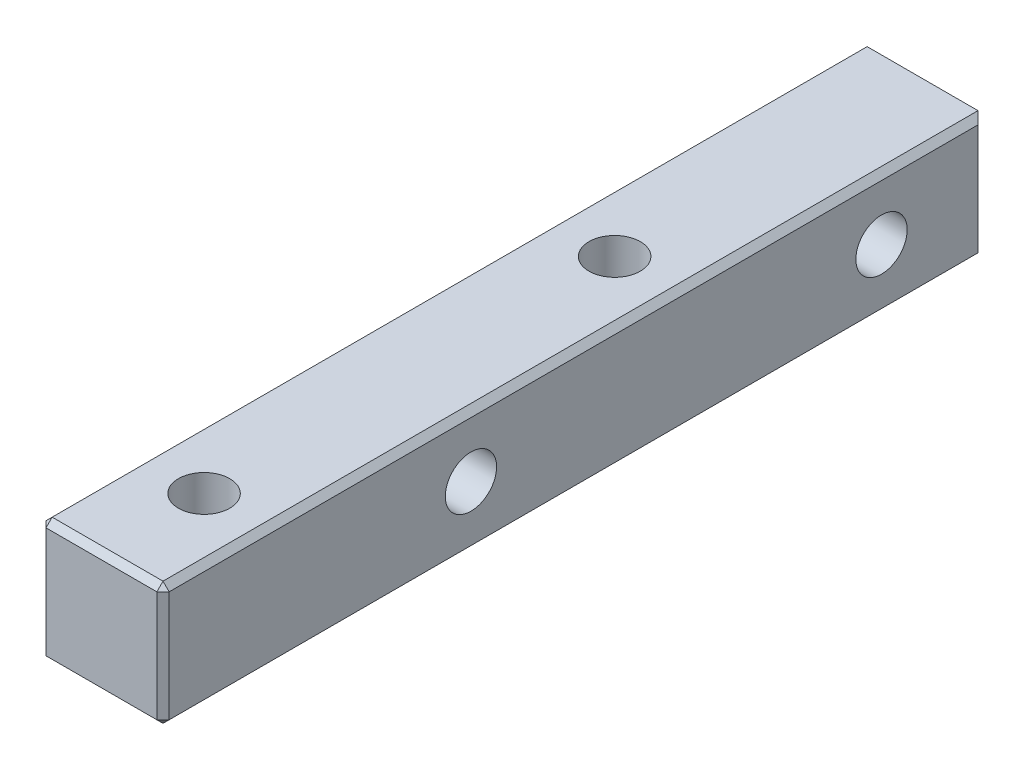
ISO-10303-21;
HEADER;
FILE_DESCRIPTION(('STEP AP214'),'2;1');
FILE_NAME('part.step','',(''),(''),'','','');
FILE_SCHEMA(('AUTOMOTIVE_DESIGN { 1 0 10303 214 1 1 1 1 }'));
ENDSEC;
DATA;
#1=APPLICATION_CONTEXT('core data for automotive mechanical design processes');
#2=APPLICATION_PROTOCOL_DEFINITION('international standard','automotive_design',2000,#1);
#3=PRODUCT_CONTEXT('',#1,'mechanical');
#4=PRODUCT('Part','Part','',(#3));
#5=PRODUCT_RELATED_PRODUCT_CATEGORY('part','',(#4));
#6=PRODUCT_DEFINITION_FORMATION('','',#4);
#7=PRODUCT_DEFINITION_CONTEXT('part definition',#1,'design');
#8=PRODUCT_DEFINITION('design','',#6,#7);
#9=PRODUCT_DEFINITION_SHAPE('','',#8);
#10=(LENGTH_UNIT() NAMED_UNIT(*) SI_UNIT(.MILLI.,.METRE.));
#11=(NAMED_UNIT(*) PLANE_ANGLE_UNIT() SI_UNIT($,.RADIAN.));
#12=(NAMED_UNIT(*) SI_UNIT($,.STERADIAN.) SOLID_ANGLE_UNIT());
#13=UNCERTAINTY_MEASURE_WITH_UNIT(LENGTH_MEASURE(1.E-05),#10,'distance_accuracy_value','');
#14=(GEOMETRIC_REPRESENTATION_CONTEXT(3) GLOBAL_UNCERTAINTY_ASSIGNED_CONTEXT((#13)) GLOBAL_UNIT_ASSIGNED_CONTEXT((#10,
#11,#12)) REPRESENTATION_CONTEXT('',''));
#15=CARTESIAN_POINT('',(0.,0.,0.));
#16=DIRECTION('',(0.,0.,1.));
#17=DIRECTION('',(1.,0.,0.));
#18=AXIS2_PLACEMENT_3D('',#15,#16,#17);
#19=CARTESIAN_POINT('',(-3.,3.,20.));
#20=DIRECTION('',(0.,-1.,0.));
#21=DIRECTION('',(1.,0.,0.));
#22=AXIS2_PLACEMENT_3D('',#19,#20,#21);
#23=PLANE('',#22);
#24=DIRECTION('',(1.,0.,0.));
#25=VECTOR('',#24,1.);
#26=CARTESIAN_POINT('',(-3.,3.,19.7));
#27=LINE('',#26,#25);
#28=CARTESIAN_POINT('',(-2.7,3.,19.7));
#29=VERTEX_POINT('',#28);
#30=CARTESIAN_POINT('',(2.7,3.,19.7));
#31=VERTEX_POINT('',#30);
#32=EDGE_CURVE('E57',#29,#31,#27,.T.);
#33=ORIENTED_EDGE('',*,*,#32,.T.);
#34=DIRECTION('',(0.,0.,-1.));
#35=VECTOR('',#34,1.);
#36=CARTESIAN_POINT('',(2.7,3.,20.));
#37=LINE('',#36,#35);
#38=CARTESIAN_POINT('',(2.7,3.,-20.));
#39=VERTEX_POINT('',#38);
#40=EDGE_CURVE('E11',#31,#39,#37,.T.);
#41=ORIENTED_EDGE('',*,*,#40,.T.);
#42=DIRECTION('',(-1.,0.,0.));
#43=VECTOR('',#42,1.);
#44=CARTESIAN_POINT('',(-3.,3.,-20.));
#45=LINE('',#44,#43);
#46=CARTESIAN_POINT('',(-2.7,3.,-20.));
#47=VERTEX_POINT('',#46);
#48=EDGE_CURVE('E163',#39,#47,#45,.T.);
#49=ORIENTED_EDGE('',*,*,#48,.T.);
#50=DIRECTION('',(0.,0.,1.));
#51=VECTOR('',#50,1.);
#52=CARTESIAN_POINT('',(-2.7,3.,20.));
#53=LINE('',#52,#51);
#54=EDGE_CURVE('E68',#47,#29,#53,.T.);
#55=ORIENTED_EDGE('',*,*,#54,.T.);
#56=EDGE_LOOP('',(#33,#41,#49,#55));
#57=FACE_BOUND('',#56,.T.);
#58=CARTESIAN_POINT('',(0.,3.,15.));
#59=DIRECTION('',(0.,1.,0.));
#60=DIRECTION('',(0.,0.,1.));
#61=AXIS2_PLACEMENT_3D('',#58,#59,#60);
#62=CIRCLE('',#61,1.24999999999999);
#63=CARTESIAN_POINT('',(0.,3.,16.25));
#64=VERTEX_POINT('',#63);
#65=EDGE_CURVE('E303',#64,#64,#62,.T.);
#66=ORIENTED_EDGE('',*,*,#65,.F.);
#67=EDGE_LOOP('',(#66));
#68=FACE_BOUND('',#67,.T.);
#69=CARTESIAN_POINT('',(0.,3.,-5.));
#70=DIRECTION('',(0.,1.,0.));
#71=DIRECTION('',(0.,0.,1.));
#72=AXIS2_PLACEMENT_3D('',#69,#70,#71);
#73=CIRCLE('',#72,1.24999999999999);
#74=CARTESIAN_POINT('',(0.,3.,-3.75000000000001));
#75=VERTEX_POINT('',#74);
#76=EDGE_CURVE('E291',#75,#75,#73,.T.);
#77=ORIENTED_EDGE('',*,*,#76,.F.);
#78=EDGE_LOOP('',(#77));
#79=FACE_BOUND('',#78,.T.);
#80=ADVANCED_FACE('F46',(#57,#68,#79),#23,.F.);
#81=CARTESIAN_POINT('',(3.,-3.,20.));
#82=DIRECTION('',(-1.,0.,0.));
#83=DIRECTION('',(0.,-1.,0.));
#84=AXIS2_PLACEMENT_3D('',#81,#82,#83);
#85=PLANE('',#84);
#86=DIRECTION('',(0.,0.,1.));
#87=VECTOR('',#86,1.);
#88=CARTESIAN_POINT('',(3.,2.7,20.));
#89=LINE('',#88,#87);
#90=CARTESIAN_POINT('',(3.,2.7,-19.7));
#91=VERTEX_POINT('',#90);
#92=CARTESIAN_POINT('',(3.,2.7,19.7));
#93=VERTEX_POINT('',#92);
#94=EDGE_CURVE('E203',#91,#93,#89,.T.);
#95=ORIENTED_EDGE('',*,*,#94,.T.);
#96=DIRECTION('',(0.,-1.,0.));
#97=VECTOR('',#96,1.);
#98=CARTESIAN_POINT('',(3.,-3.,19.7));
#99=LINE('',#98,#97);
#100=CARTESIAN_POINT('',(3.,-2.7,19.7));
#101=VERTEX_POINT('',#100);
#102=EDGE_CURVE('E212',#93,#101,#99,.T.);
#103=ORIENTED_EDGE('',*,*,#102,.T.);
#104=DIRECTION('',(0.,0.,-1.));
#105=VECTOR('',#104,1.);
#106=CARTESIAN_POINT('',(3.,-2.7,20.));
#107=LINE('',#106,#105);
#108=CARTESIAN_POINT('',(3.,-2.7,-19.7));
#109=VERTEX_POINT('',#108);
#110=EDGE_CURVE('E209',#101,#109,#107,.T.);
#111=ORIENTED_EDGE('',*,*,#110,.T.);
#112=DIRECTION('',(0.,1.,0.));
#113=VECTOR('',#112,1.);
#114=CARTESIAN_POINT('',(3.,3.,-19.7));
#115=LINE('',#114,#113);
#116=EDGE_CURVE('E206',#109,#91,#115,.T.);
#117=ORIENTED_EDGE('',*,*,#116,.T.);
#118=EDGE_LOOP('',(#95,#103,#111,#117));
#119=FACE_BOUND('',#118,.T.);
#120=CARTESIAN_POINT('',(3.,0.,-15.));
#121=DIRECTION('',(-1.,0.,0.));
#122=DIRECTION('',(0.,-1.,0.));
#123=AXIS2_PLACEMENT_3D('',#120,#121,#122);
#124=CIRCLE('',#123,1.24999999999999);
#125=CARTESIAN_POINT('',(3.,-1.24999999999999,-15.));
#126=VERTEX_POINT('',#125);
#127=EDGE_CURVE('E317',#126,#126,#124,.T.);
#128=ORIENTED_EDGE('',*,*,#127,.T.);
#129=EDGE_LOOP('',(#128));
#130=FACE_BOUND('',#129,.T.);
#131=CARTESIAN_POINT('',(3.,0.,5.));
#132=DIRECTION('',(-1.,0.,0.));
#133=DIRECTION('',(0.,-1.,0.));
#134=AXIS2_PLACEMENT_3D('',#131,#132,#133);
#135=CIRCLE('',#134,1.24999999999999);
#136=CARTESIAN_POINT('',(3.,-1.24999999999999,5.));
#137=VERTEX_POINT('',#136);
#138=EDGE_CURVE('E325',#137,#137,#135,.T.);
#139=ORIENTED_EDGE('',*,*,#138,.T.);
#140=EDGE_LOOP('',(#139));
#141=FACE_BOUND('',#140,.T.);
#142=ADVANCED_FACE('F380',(#119,#130,#141),#85,.F.);
#143=CARTESIAN_POINT('',(-3.,-3.,20.));
#144=DIRECTION('',(1.,0.,0.));
#145=DIRECTION('',(0.,0.,-1.));
#146=AXIS2_PLACEMENT_3D('',#143,#144,#145);
#147=PLANE('',#146);
#148=DIRECTION('',(0.,-1.,0.));
#149=VECTOR('',#148,1.);
#150=CARTESIAN_POINT('',(-3.,-3.,-19.7));
#151=LINE('',#150,#149);
#152=CARTESIAN_POINT('',(-3.,2.7,-19.7));
#153=VERTEX_POINT('',#152);
#154=CARTESIAN_POINT('',(-3.,-2.7,-19.7));
#155=VERTEX_POINT('',#154);
#156=EDGE_CURVE('E185',#153,#155,#151,.T.);
#157=ORIENTED_EDGE('',*,*,#156,.T.);
#158=DIRECTION('',(0.,0.,1.));
#159=VECTOR('',#158,1.);
#160=CARTESIAN_POINT('',(-3.,-2.7,20.));
#161=LINE('',#160,#159);
#162=CARTESIAN_POINT('',(-3.,-2.7,19.7));
#163=VERTEX_POINT('',#162);
#164=EDGE_CURVE('E137',#155,#163,#161,.T.);
#165=ORIENTED_EDGE('',*,*,#164,.T.);
#166=DIRECTION('',(0.,1.,0.));
#167=VECTOR('',#166,1.);
#168=CARTESIAN_POINT('',(-3.,-3.,19.7));
#169=LINE('',#168,#167);
#170=CARTESIAN_POINT('',(-3.,2.7,19.7));
#171=VERTEX_POINT('',#170);
#172=EDGE_CURVE('E182',#163,#171,#169,.T.);
#173=ORIENTED_EDGE('',*,*,#172,.T.);
#174=DIRECTION('',(0.,0.,-1.));
#175=VECTOR('',#174,1.);
#176=CARTESIAN_POINT('',(-3.,2.7,20.));
#177=LINE('',#176,#175);
#178=EDGE_CURVE('E175',#171,#153,#177,.T.);
#179=ORIENTED_EDGE('',*,*,#178,.T.);
#180=EDGE_LOOP('',(#157,#165,#173,#179));
#181=FACE_BOUND('',#180,.T.);
#182=CARTESIAN_POINT('',(-3.,0.,-15.));
#183=DIRECTION('',(-1.,0.,0.));
#184=DIRECTION('',(0.,0.,1.));
#185=AXIS2_PLACEMENT_3D('',#182,#183,#184);
#186=CIRCLE('',#185,1.24999999999999);
#187=CARTESIAN_POINT('',(-3.,0.,-13.75));
#188=VERTEX_POINT('',#187);
#189=EDGE_CURVE('E313',#188,#188,#186,.T.);
#190=ORIENTED_EDGE('',*,*,#189,.F.);
#191=EDGE_LOOP('',(#190));
#192=FACE_BOUND('',#191,.T.);
#193=CARTESIAN_POINT('',(-3.,0.,5.));
#194=DIRECTION('',(-1.,0.,0.));
#195=DIRECTION('',(0.,0.,1.));
#196=AXIS2_PLACEMENT_3D('',#193,#194,#195);
#197=CIRCLE('',#196,1.24999999999999);
#198=CARTESIAN_POINT('',(-3.,0.,6.24999999999999));
#199=VERTEX_POINT('',#198);
#200=EDGE_CURVE('E321',#199,#199,#197,.T.);
#201=ORIENTED_EDGE('',*,*,#200,.F.);
#202=EDGE_LOOP('',(#201));
#203=FACE_BOUND('',#202,.T.);
#204=ADVANCED_FACE('F343',(#181,#192,#203),#147,.F.);
#205=CARTESIAN_POINT('',(-3.,-3.,20.));
#206=DIRECTION('',(0.,1.,0.));
#207=DIRECTION('',(0.,0.,1.));
#208=AXIS2_PLACEMENT_3D('',#205,#206,#207);
#209=PLANE('',#208);
#210=DIRECTION('',(0.,0.,1.));
#211=VECTOR('',#210,1.);
#212=CARTESIAN_POINT('',(2.7,-3.,20.));
#213=LINE('',#212,#211);
#214=CARTESIAN_POINT('',(2.7,-3.,-19.7));
#215=VERTEX_POINT('',#214);
#216=CARTESIAN_POINT('',(2.7,-3.,19.7));
#217=VERTEX_POINT('',#216);
#218=EDGE_CURVE('E162',#215,#217,#213,.T.);
#219=ORIENTED_EDGE('',*,*,#218,.T.);
#220=DIRECTION('',(-1.,0.,0.));
#221=VECTOR('',#220,1.);
#222=CARTESIAN_POINT('',(-3.,-3.,19.7));
#223=LINE('',#222,#221);
#224=CARTESIAN_POINT('',(-2.7,-3.,19.7));
#225=VERTEX_POINT('',#224);
#226=EDGE_CURVE('E168',#217,#225,#223,.T.);
#227=ORIENTED_EDGE('',*,*,#226,.T.);
#228=DIRECTION('',(0.,0.,-1.));
#229=VECTOR('',#228,1.);
#230=CARTESIAN_POINT('',(-2.7,-3.,20.));
#231=LINE('',#230,#229);
#232=CARTESIAN_POINT('',(-2.7,-3.,-19.7));
#233=VERTEX_POINT('',#232);
#234=EDGE_CURVE('E135',#225,#233,#231,.T.);
#235=ORIENTED_EDGE('',*,*,#234,.T.);
#236=DIRECTION('',(1.,0.,0.));
#237=VECTOR('',#236,1.);
#238=CARTESIAN_POINT('',(3.,-3.,-19.7));
#239=LINE('',#238,#237);
#240=EDGE_CURVE('E155',#233,#215,#239,.T.);
#241=ORIENTED_EDGE('',*,*,#240,.T.);
#242=EDGE_LOOP('',(#219,#227,#235,#241));
#243=FACE_BOUND('',#242,.T.);
#244=CARTESIAN_POINT('',(0.,-3.,-5.));
#245=DIRECTION('',(0.,1.,0.));
#246=DIRECTION('',(0.,0.,1.));
#247=AXIS2_PLACEMENT_3D('',#244,#245,#246);
#248=CIRCLE('',#247,1.24999999999999);
#249=CARTESIAN_POINT('',(0.,-3.,-3.75000000000001));
#250=VERTEX_POINT('',#249);
#251=EDGE_CURVE('E297',#250,#250,#248,.T.);
#252=ORIENTED_EDGE('',*,*,#251,.T.);
#253=EDGE_LOOP('',(#252));
#254=FACE_BOUND('',#253,.T.);
#255=CARTESIAN_POINT('',(0.,-3.,15.));
#256=DIRECTION('',(0.,1.,0.));
#257=DIRECTION('',(0.,0.,1.));
#258=AXIS2_PLACEMENT_3D('',#255,#256,#257);
#259=CIRCLE('',#258,1.24999999999999);
#260=CARTESIAN_POINT('',(0.,-3.,16.25));
#261=VERTEX_POINT('',#260);
#262=EDGE_CURVE('E309',#261,#261,#259,.T.);
#263=ORIENTED_EDGE('',*,*,#262,.T.);
#264=EDGE_LOOP('',(#263));
#265=FACE_BOUND('',#264,.T.);
#266=ADVANCED_FACE('F165',(#243,#254,#265),#209,.F.);
#267=CARTESIAN_POINT('',(0.,0.,20.));
#268=DIRECTION('',(0.,0.,-1.));
#269=DIRECTION('',(-1.,0.,0.));
#270=AXIS2_PLACEMENT_3D('',#267,#268,#269);
#271=PLANE('',#270);
#272=DIRECTION('',(1.,0.,0.));
#273=VECTOR('',#272,1.);
#274=CARTESIAN_POINT('',(0.,-2.7,20.));
#275=LINE('',#274,#273);
#276=CARTESIAN_POINT('',(-2.7,-2.7,20.));
#277=VERTEX_POINT('',#276);
#278=CARTESIAN_POINT('',(2.7,-2.7,20.));
#279=VERTEX_POINT('',#278);
#280=EDGE_CURVE('E196',#277,#279,#275,.T.);
#281=ORIENTED_EDGE('',*,*,#280,.T.);
#282=DIRECTION('',(0.,1.,0.));
#283=VECTOR('',#282,1.);
#284=CARTESIAN_POINT('',(2.7,0.,20.));
#285=LINE('',#284,#283);
#286=CARTESIAN_POINT('',(2.7,2.7,20.));
#287=VERTEX_POINT('',#286);
#288=EDGE_CURVE('E199',#279,#287,#285,.T.);
#289=ORIENTED_EDGE('',*,*,#288,.T.);
#290=DIRECTION('',(-1.,0.,0.));
#291=VECTOR('',#290,1.);
#292=CARTESIAN_POINT('',(0.,2.7,20.));
#293=LINE('',#292,#291);
#294=CARTESIAN_POINT('',(-2.7,2.7,20.));
#295=VERTEX_POINT('',#294);
#296=EDGE_CURVE('E193',#287,#295,#293,.T.);
#297=ORIENTED_EDGE('',*,*,#296,.T.);
#298=DIRECTION('',(0.,-1.,0.));
#299=VECTOR('',#298,1.);
#300=CARTESIAN_POINT('',(-2.7,0.,20.));
#301=LINE('',#300,#299);
#302=EDGE_CURVE('E190',#295,#277,#301,.T.);
#303=ORIENTED_EDGE('',*,*,#302,.T.);
#304=EDGE_LOOP('',(#281,#289,#297,#303));
#305=FACE_BOUND('',#304,.T.);
#306=ADVANCED_FACE('F362',(#305),#271,.F.);
#307=CARTESIAN_POINT('',(0.,0.,-20.));
#308=DIRECTION('',(0.,0.,-1.));
#309=DIRECTION('',(-1.,0.,0.));
#310=AXIS2_PLACEMENT_3D('',#307,#308,#309);
#311=PLANE('',#310);
#312=DIRECTION('',(-1.,0.,0.));
#313=VECTOR('',#312,1.);
#314=CARTESIAN_POINT('',(-3.,-2.7,-20.));
#315=LINE('',#314,#313);
#316=CARTESIAN_POINT('',(2.7,-2.7,-20.));
#317=VERTEX_POINT('',#316);
#318=CARTESIAN_POINT('',(-2.7,-2.7,-20.));
#319=VERTEX_POINT('',#318);
#320=EDGE_CURVE('E219',#317,#319,#315,.T.);
#321=ORIENTED_EDGE('',*,*,#320,.T.);
#322=DIRECTION('',(0.,1.,0.));
#323=VECTOR('',#322,1.);
#324=CARTESIAN_POINT('',(-2.7,3.,-20.));
#325=LINE('',#324,#323);
#326=EDGE_CURVE('E223',#319,#47,#325,.T.);
#327=ORIENTED_EDGE('',*,*,#326,.T.);
#328=ORIENTED_EDGE('',*,*,#48,.F.);
#329=DIRECTION('',(0.,-1.,0.));
#330=VECTOR('',#329,1.);
#331=CARTESIAN_POINT('',(2.7,-3.,-20.));
#332=LINE('',#331,#330);
#333=EDGE_CURVE('E216',#39,#317,#332,.T.);
#334=ORIENTED_EDGE('',*,*,#333,.T.);
#335=EDGE_LOOP('',(#321,#327,#328,#334));
#336=FACE_BOUND('',#335,.T.);
#337=ADVANCED_FACE('F482',(#336),#311,.T.);
#338=CARTESIAN_POINT('',(-3.,0.,5.));
#339=DIRECTION('',(-1.,0.,0.));
#340=DIRECTION('',(0.,0.,1.));
#341=AXIS2_PLACEMENT_3D('',#338,#339,#340);
#342=CYLINDRICAL_SURFACE('',#341,1.24999999999999);
#343=ORIENTED_EDGE('',*,*,#138,.F.);
#344=EDGE_LOOP('',(#343));
#345=FACE_BOUND('',#344,.T.);
#346=ORIENTED_EDGE('',*,*,#200,.T.);
#347=EDGE_LOOP('',(#346));
#348=FACE_BOUND('',#347,.T.);
#349=ADVANCED_FACE('F478',(#345,#348),#342,.F.);
#350=CARTESIAN_POINT('',(-3.,0.,-15.));
#351=DIRECTION('',(-1.,0.,0.));
#352=DIRECTION('',(0.,0.,1.));
#353=AXIS2_PLACEMENT_3D('',#350,#351,#352);
#354=CYLINDRICAL_SURFACE('',#353,1.24999999999999);
#355=ORIENTED_EDGE('',*,*,#127,.F.);
#356=EDGE_LOOP('',(#355));
#357=FACE_BOUND('',#356,.T.);
#358=ORIENTED_EDGE('',*,*,#189,.T.);
#359=EDGE_LOOP('',(#358));
#360=FACE_BOUND('',#359,.T.);
#361=ADVANCED_FACE('F471',(#357,#360),#354,.F.);
#362=CARTESIAN_POINT('',(0.,3.,15.));
#363=DIRECTION('',(0.,1.,0.));
#364=DIRECTION('',(0.,0.,1.));
#365=AXIS2_PLACEMENT_3D('',#362,#363,#364);
#366=CYLINDRICAL_SURFACE('',#365,1.24999999999999);
#367=ORIENTED_EDGE('',*,*,#262,.F.);
#368=EDGE_LOOP('',(#367));
#369=FACE_BOUND('',#368,.T.);
#370=ORIENTED_EDGE('',*,*,#65,.T.);
#371=EDGE_LOOP('',(#370));
#372=FACE_BOUND('',#371,.T.);
#373=ADVANCED_FACE('F465',(#369,#372),#366,.F.);
#374=CARTESIAN_POINT('',(0.,3.,-5.));
#375=DIRECTION('',(0.,1.,0.));
#376=DIRECTION('',(0.,0.,1.));
#377=AXIS2_PLACEMENT_3D('',#374,#375,#376);
#378=CYLINDRICAL_SURFACE('',#377,1.24999999999999);
#379=ORIENTED_EDGE('',*,*,#251,.F.);
#380=EDGE_LOOP('',(#379));
#381=FACE_BOUND('',#380,.T.);
#382=ORIENTED_EDGE('',*,*,#76,.T.);
#383=EDGE_LOOP('',(#382));
#384=FACE_BOUND('',#383,.T.);
#385=ADVANCED_FACE('F461',(#381,#384),#378,.F.);
#386=CARTESIAN_POINT('',(2.7,2.7,20.));
#387=DIRECTION('',(0.577350269189626,0.577350269189626,0.577350269189626));
#388=DIRECTION('',(0.707106781186547,0.,-0.707106781186547));
#389=AXIS2_PLACEMENT_3D('',#386,#387,#388);
#390=PLANE('',#389);
#391=DIRECTION('',(-0.707106781186547,0.,0.707106781186547));
#392=VECTOR('',#391,1.);
#393=CARTESIAN_POINT('',(2.7,2.7,20.));
#394=LINE('',#393,#392);
#395=EDGE_CURVE('E282',#93,#287,#394,.T.);
#396=ORIENTED_EDGE('',*,*,#395,.F.);
#397=DIRECTION('',(0.707106781186547,-0.707106781186547,0.));
#398=VECTOR('',#397,1.);
#399=CARTESIAN_POINT('',(2.85,2.85,19.7));
#400=LINE('',#399,#398);
#401=EDGE_CURVE('E51',#31,#93,#400,.T.);
#402=ORIENTED_EDGE('',*,*,#401,.F.);
#403=DIRECTION('',(0.,0.707106781186547,-0.707106781186547));
#404=VECTOR('',#403,1.);
#405=CARTESIAN_POINT('',(2.7,2.7,20.));
#406=LINE('',#405,#404);
#407=EDGE_CURVE('E285',#287,#31,#406,.T.);
#408=ORIENTED_EDGE('',*,*,#407,.F.);
#409=EDGE_LOOP('',(#396,#402,#408));
#410=FACE_BOUND('',#409,.T.);
#411=ADVANCED_FACE('F49',(#410),#390,.T.);
#412=CARTESIAN_POINT('',(2.7,3.,20.));
#413=DIRECTION('',(-0.707106781186547,-0.707106781186547,0.));
#414=DIRECTION('',(0.,0.,-1.));
#415=AXIS2_PLACEMENT_3D('',#412,#413,#414);
#416=PLANE('',#415);
#417=ORIENTED_EDGE('',*,*,#401,.T.);
#418=ORIENTED_EDGE('',*,*,#94,.F.);
#419=DIRECTION('',(0.577350269189624,-0.577350269189624,0.57735026918963));
#420=VECTOR('',#419,1.);
#421=CARTESIAN_POINT('',(16.0333333333334,-10.3333333333334,-6.66666666666647));
#422=LINE('',#421,#420);
#423=EDGE_CURVE('E278',#39,#91,#422,.T.);
#424=ORIENTED_EDGE('',*,*,#423,.F.);
#425=ORIENTED_EDGE('',*,*,#40,.F.);
#426=EDGE_LOOP('',(#417,#418,#424,#425));
#427=FACE_BOUND('',#426,.T.);
#428=ADVANCED_FACE('F453',(#427),#416,.F.);
#429=CARTESIAN_POINT('',(0.,2.7,20.));
#430=DIRECTION('',(0.,-0.707106781186547,-0.707106781186547));
#431=DIRECTION('',(-1.,0.,0.));
#432=AXIS2_PLACEMENT_3D('',#429,#430,#431);
#433=PLANE('',#432);
#434=ORIENTED_EDGE('',*,*,#407,.T.);
#435=ORIENTED_EDGE('',*,*,#32,.F.);
#436=DIRECTION('',(0.,-0.707106781186548,0.707106781186548));
#437=VECTOR('',#436,1.);
#438=CARTESIAN_POINT('',(-2.7,2.7,20.));
#439=LINE('',#438,#437);
#440=EDGE_CURVE('E274',#295,#29,#439,.F.);
#441=ORIENTED_EDGE('',*,*,#440,.F.);
#442=ORIENTED_EDGE('',*,*,#296,.F.);
#443=EDGE_LOOP('',(#434,#435,#441,#442));
#444=FACE_BOUND('',#443,.T.);
#445=ADVANCED_FACE('F354',(#444),#433,.F.);
#446=CARTESIAN_POINT('',(2.7,0.,20.));
#447=DIRECTION('',(-0.707106781186547,0.,-0.707106781186547));
#448=DIRECTION('',(0.,1.,0.));
#449=AXIS2_PLACEMENT_3D('',#446,#447,#448);
#450=PLANE('',#449);
#451=ORIENTED_EDGE('',*,*,#395,.T.);
#452=ORIENTED_EDGE('',*,*,#288,.F.);
#453=DIRECTION('',(0.707106781186548,0.,-0.707106781186548));
#454=VECTOR('',#453,1.);
#455=CARTESIAN_POINT('',(3.,-2.7,19.7));
#456=LINE('',#455,#454);
#457=EDGE_CURVE('E270',#101,#279,#456,.F.);
#458=ORIENTED_EDGE('',*,*,#457,.F.);
#459=ORIENTED_EDGE('',*,*,#102,.F.);
#460=EDGE_LOOP('',(#451,#452,#458,#459));
#461=FACE_BOUND('',#460,.T.);
#462=ADVANCED_FACE('F360',(#461),#450,.F.);
#463=CARTESIAN_POINT('',(3.,-2.7,20.));
#464=DIRECTION('',(-0.707106781186547,0.707106781186547,0.));
#465=DIRECTION('',(0.,0.,-1.));
#466=AXIS2_PLACEMENT_3D('',#463,#464,#465);
#467=PLANE('',#466);
#468=DIRECTION('',(0.707106781186548,0.707106781186548,0.));
#469=VECTOR('',#468,1.);
#470=CARTESIAN_POINT('',(3.,-2.7,-19.7));
#471=LINE('',#470,#469);
#472=EDGE_CURVE('E263',#109,#215,#471,.F.);
#473=ORIENTED_EDGE('',*,*,#472,.F.);
#474=ORIENTED_EDGE('',*,*,#110,.F.);
#475=DIRECTION('',(-0.707106781186547,-0.707106781186547,0.));
#476=VECTOR('',#475,1.);
#477=CARTESIAN_POINT('',(3.,-2.7,19.7));
#478=LINE('',#477,#476);
#479=EDGE_CURVE('E267',#217,#101,#478,.F.);
#480=ORIENTED_EDGE('',*,*,#479,.F.);
#481=ORIENTED_EDGE('',*,*,#218,.F.);
#482=EDGE_LOOP('',(#473,#474,#480,#481));
#483=FACE_BOUND('',#482,.T.);
#484=ADVANCED_FACE('F442',(#483),#467,.F.);
#485=CARTESIAN_POINT('',(3.,-3.,-19.7));
#486=DIRECTION('',(0.707106781186552,0.,-0.707106781186543));
#487=DIRECTION('',(0.,-1.,0.));
#488=AXIS2_PLACEMENT_3D('',#485,#486,#487);
#489=PLANE('',#488);
#490=ORIENTED_EDGE('',*,*,#423,.T.);
#491=ORIENTED_EDGE('',*,*,#116,.F.);
#492=DIRECTION('',(0.707106781186543,0.,0.707106781186552));
#493=VECTOR('',#492,1.);
#494=CARTESIAN_POINT('',(3.,-2.7,-19.7));
#495=LINE('',#494,#493);
#496=EDGE_CURVE('E259',#317,#109,#495,.T.);
#497=ORIENTED_EDGE('',*,*,#496,.F.);
#498=ORIENTED_EDGE('',*,*,#333,.F.);
#499=EDGE_LOOP('',(#490,#491,#497,#498));
#500=FACE_BOUND('',#499,.T.);
#501=ADVANCED_FACE('F437',(#500),#489,.T.);
#502=CARTESIAN_POINT('',(-2.7,2.7,20.));
#503=DIRECTION('',(-0.577350269189626,0.577350269189626,0.577350269189626));
#504=DIRECTION('',(0.707106781186547,0.,0.707106781186547));
#505=AXIS2_PLACEMENT_3D('',#502,#503,#504);
#506=PLANE('',#505);
#507=DIRECTION('',(-0.707106781186547,0.,-0.707106781186547));
#508=VECTOR('',#507,1.);
#509=CARTESIAN_POINT('',(-2.7,2.7,20.));
#510=LINE('',#509,#508);
#511=EDGE_CURVE('E251',#295,#171,#510,.T.);
#512=ORIENTED_EDGE('',*,*,#511,.F.);
#513=ORIENTED_EDGE('',*,*,#440,.T.);
#514=DIRECTION('',(0.707106781186547,0.707106781186547,0.));
#515=VECTOR('',#514,1.);
#516=CARTESIAN_POINT('',(-2.85,2.85,19.7));
#517=LINE('',#516,#515);
#518=EDGE_CURVE('E255',#171,#29,#517,.T.);
#519=ORIENTED_EDGE('',*,*,#518,.F.);
#520=EDGE_LOOP('',(#512,#513,#519));
#521=FACE_BOUND('',#520,.T.);
#522=ADVANCED_FACE('F352',(#521),#506,.T.);
#523=CARTESIAN_POINT('',(3.,-2.7,19.7));
#524=DIRECTION('',(0.577350269189626,-0.577350269189626,0.577350269189626));
#525=DIRECTION('',(0.707106781186547,0.,-0.707106781186547));
#526=AXIS2_PLACEMENT_3D('',#523,#524,#525);
#527=PLANE('',#526);
#528=ORIENTED_EDGE('',*,*,#479,.T.);
#529=ORIENTED_EDGE('',*,*,#457,.T.);
#530=DIRECTION('',(0.,0.707106781186547,0.707106781186547));
#531=VECTOR('',#530,1.);
#532=CARTESIAN_POINT('',(2.7,-2.85,19.85));
#533=LINE('',#532,#531);
#534=EDGE_CURVE('E247',#217,#279,#533,.T.);
#535=ORIENTED_EDGE('',*,*,#534,.F.);
#536=EDGE_LOOP('',(#528,#529,#535));
#537=FACE_BOUND('',#536,.T.);
#538=ADVANCED_FACE('F428',(#537),#527,.T.);
#539=CARTESIAN_POINT('',(3.,-2.7,-19.7));
#540=DIRECTION('',(0.577350269189628,-0.577350269189628,-0.577350269189621));
#541=DIRECTION('',(0.707106781186547,0.707106781186547,0.));
#542=AXIS2_PLACEMENT_3D('',#539,#540,#541);
#543=PLANE('',#542);
#544=ORIENTED_EDGE('',*,*,#496,.T.);
#545=ORIENTED_EDGE('',*,*,#472,.T.);
#546=DIRECTION('',(0.,0.707106781186543,-0.707106781186552));
#547=VECTOR('',#546,1.);
#548=CARTESIAN_POINT('',(2.7,-2.85,-19.85));
#549=LINE('',#548,#547);
#550=EDGE_CURVE('E158',#317,#215,#549,.F.);
#551=ORIENTED_EDGE('',*,*,#550,.F.);
#552=EDGE_LOOP('',(#544,#545,#551));
#553=FACE_BOUND('',#552,.T.);
#554=ADVANCED_FACE('F423',(#553),#543,.T.);
#555=CARTESIAN_POINT('',(-3.,2.7,20.));
#556=DIRECTION('',(0.707106781186547,-0.707106781186547,0.));
#557=DIRECTION('',(0.,0.,-1.));
#558=AXIS2_PLACEMENT_3D('',#555,#556,#557);
#559=PLANE('',#558);
#560=ORIENTED_EDGE('',*,*,#518,.T.);
#561=ORIENTED_EDGE('',*,*,#54,.F.);
#562=DIRECTION('',(0.577350269189624,0.577350269189624,-0.57735026918963));
#563=VECTOR('',#562,1.);
#564=CARTESIAN_POINT('',(-16.2333333333334,-10.5333333333334,-6.46666666666646));
#565=LINE('',#564,#563);
#566=EDGE_CURVE('E241',#153,#47,#565,.T.);
#567=ORIENTED_EDGE('',*,*,#566,.F.);
#568=ORIENTED_EDGE('',*,*,#178,.F.);
#569=EDGE_LOOP('',(#560,#561,#567,#568));
#570=FACE_BOUND('',#569,.T.);
#571=ADVANCED_FACE('F336',(#570),#559,.F.);
#572=CARTESIAN_POINT('',(-2.7,0.,20.));
#573=DIRECTION('',(0.707106781186547,0.,-0.707106781186547));
#574=DIRECTION('',(0.,-1.,0.));
#575=AXIS2_PLACEMENT_3D('',#572,#573,#574);
#576=PLANE('',#575);
#577=ORIENTED_EDGE('',*,*,#511,.T.);
#578=ORIENTED_EDGE('',*,*,#172,.F.);
#579=DIRECTION('',(0.707106781186547,0.,0.707106781186547));
#580=VECTOR('',#579,1.);
#581=CARTESIAN_POINT('',(-3.,-2.7,19.7));
#582=LINE('',#581,#580);
#583=EDGE_CURVE('E237',#277,#163,#582,.F.);
#584=ORIENTED_EDGE('',*,*,#583,.F.);
#585=ORIENTED_EDGE('',*,*,#302,.F.);
#586=EDGE_LOOP('',(#577,#578,#584,#585));
#587=FACE_BOUND('',#586,.T.);
#588=ADVANCED_FACE('F350',(#587),#576,.F.);
#589=CARTESIAN_POINT('',(0.,-2.7,20.));
#590=DIRECTION('',(0.,0.707106781186547,-0.707106781186547));
#591=DIRECTION('',(1.,0.,0.));
#592=AXIS2_PLACEMENT_3D('',#589,#590,#591);
#593=PLANE('',#592);
#594=ORIENTED_EDGE('',*,*,#534,.T.);
#595=ORIENTED_EDGE('',*,*,#280,.F.);
#596=DIRECTION('',(0.,-0.707106781186547,-0.707106781186547));
#597=VECTOR('',#596,1.);
#598=CARTESIAN_POINT('',(-2.7,-2.85,19.85));
#599=LINE('',#598,#597);
#600=EDGE_CURVE('E152',#225,#277,#599,.F.);
#601=ORIENTED_EDGE('',*,*,#600,.F.);
#602=ORIENTED_EDGE('',*,*,#226,.F.);
#603=EDGE_LOOP('',(#594,#595,#601,#602));
#604=FACE_BOUND('',#603,.T.);
#605=ADVANCED_FACE('F365',(#604),#593,.F.);
#606=CARTESIAN_POINT('',(-3.,-3.,-19.7));
#607=DIRECTION('',(0.,-0.707106781186552,-0.707106781186543));
#608=DIRECTION('',(-1.,0.,0.));
#609=AXIS2_PLACEMENT_3D('',#606,#607,#608);
#610=PLANE('',#609);
#611=ORIENTED_EDGE('',*,*,#550,.T.);
#612=ORIENTED_EDGE('',*,*,#240,.F.);
#613=DIRECTION('',(0.,-0.707106781186543,0.707106781186552));
#614=VECTOR('',#613,1.);
#615=CARTESIAN_POINT('',(-2.7,-3.,-19.7));
#616=LINE('',#615,#614);
#617=EDGE_CURVE('E143',#319,#233,#616,.T.);
#618=ORIENTED_EDGE('',*,*,#617,.F.);
#619=ORIENTED_EDGE('',*,*,#320,.F.);
#620=EDGE_LOOP('',(#611,#612,#618,#619));
#621=FACE_BOUND('',#620,.T.);
#622=ADVANCED_FACE('F156',(#621),#610,.T.);
#623=CARTESIAN_POINT('',(-3.,-3.,-19.7));
#624=DIRECTION('',(-0.707106781186552,0.,-0.707106781186543));
#625=DIRECTION('',(0.,1.,0.));
#626=AXIS2_PLACEMENT_3D('',#623,#624,#625);
#627=PLANE('',#626);
#628=ORIENTED_EDGE('',*,*,#566,.T.);
#629=ORIENTED_EDGE('',*,*,#326,.F.);
#630=DIRECTION('',(0.707106781186543,0.,-0.707106781186552));
#631=VECTOR('',#630,1.);
#632=CARTESIAN_POINT('',(-2.85,-2.7,-19.85));
#633=LINE('',#632,#631);
#634=EDGE_CURVE('E147',#155,#319,#633,.T.);
#635=ORIENTED_EDGE('',*,*,#634,.F.);
#636=ORIENTED_EDGE('',*,*,#156,.F.);
#637=EDGE_LOOP('',(#628,#629,#635,#636));
#638=FACE_BOUND('',#637,.T.);
#639=ADVANCED_FACE('F341',(#638),#627,.T.);
#640=CARTESIAN_POINT('',(-3.,-2.7,19.7));
#641=DIRECTION('',(-0.577350269189626,-0.577350269189626,0.577350269189626));
#642=DIRECTION('',(0.707106781186547,0.,0.707106781186547));
#643=AXIS2_PLACEMENT_3D('',#640,#641,#642);
#644=PLANE('',#643);
#645=ORIENTED_EDGE('',*,*,#600,.T.);
#646=ORIENTED_EDGE('',*,*,#583,.T.);
#647=DIRECTION('',(-0.707106781186547,0.707106781186547,0.));
#648=VECTOR('',#647,1.);
#649=CARTESIAN_POINT('',(-3.,-2.7,19.7));
#650=LINE('',#649,#648);
#651=EDGE_CURVE('E140',#225,#163,#650,.T.);
#652=ORIENTED_EDGE('',*,*,#651,.F.);
#653=EDGE_LOOP('',(#645,#646,#652));
#654=FACE_BOUND('',#653,.T.);
#655=ADVANCED_FACE('F369',(#654),#644,.T.);
#656=CARTESIAN_POINT('',(-2.7,-3.,-19.7));
#657=DIRECTION('',(-0.577350269189628,-0.577350269189628,-0.577350269189621));
#658=DIRECTION('',(0.707106781186547,-0.707106781186547,0.));
#659=AXIS2_PLACEMENT_3D('',#656,#657,#658);
#660=PLANE('',#659);
#661=ORIENTED_EDGE('',*,*,#634,.T.);
#662=ORIENTED_EDGE('',*,*,#617,.T.);
#663=DIRECTION('',(0.707106781186548,-0.707106781186548,0.));
#664=VECTOR('',#663,1.);
#665=CARTESIAN_POINT('',(-2.7,-3.,-19.7));
#666=LINE('',#665,#664);
#667=EDGE_CURVE('E131',#155,#233,#666,.T.);
#668=ORIENTED_EDGE('',*,*,#667,.F.);
#669=EDGE_LOOP('',(#661,#662,#668));
#670=FACE_BOUND('',#669,.T.);
#671=ADVANCED_FACE('F145',(#670),#660,.T.);
#672=CARTESIAN_POINT('',(-2.7,-3.,20.));
#673=DIRECTION('',(0.707106781186547,0.707106781186547,0.));
#674=DIRECTION('',(0.,0.,-1.));
#675=AXIS2_PLACEMENT_3D('',#672,#673,#674);
#676=PLANE('',#675);
#677=ORIENTED_EDGE('',*,*,#651,.T.);
#678=ORIENTED_EDGE('',*,*,#164,.F.);
#679=ORIENTED_EDGE('',*,*,#667,.T.);
#680=ORIENTED_EDGE('',*,*,#234,.F.);
#681=EDGE_LOOP('',(#677,#678,#679,#680));
#682=FACE_BOUND('',#681,.T.);
#683=ADVANCED_FACE('F133',(#682),#676,.F.);
#684=CLOSED_SHELL('',(#80,#142,#204,#266,#306,#337,#349,#361,#373,#385,#411,#428,#445,#462,#484,
#501,#522,#538,#554,#571,#588,#605,#622,#639,#655,#671,#683));
#685=MANIFOLD_SOLID_BREP('B2',#684);
#686=ADVANCED_BREP_SHAPE_REPRESENTATION('',(#18,#685),#14);
#687=SHAPE_DEFINITION_REPRESENTATION(#9,#686);
ENDSEC;
END-ISO-10303-21;
